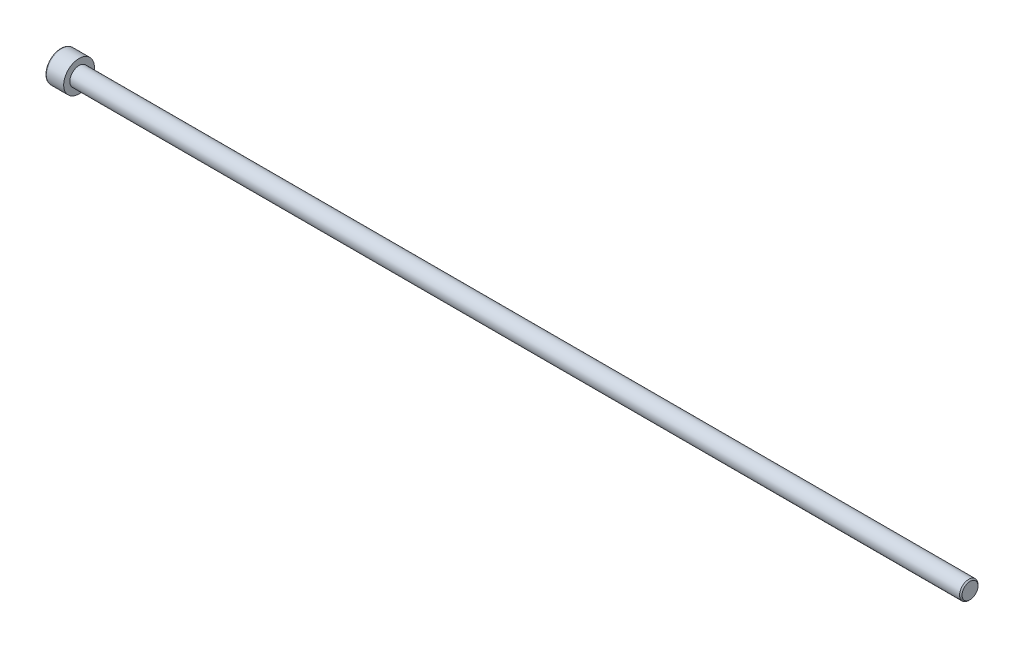
ISO-10303-21;
HEADER;
FILE_DESCRIPTION(('STEP AP214'),'2;1');
FILE_NAME('part.step','',(''),(''),'','','');
FILE_SCHEMA(('AUTOMOTIVE_DESIGN { 1 0 10303 214 1 1 1 1 }'));
ENDSEC;
DATA;
#1=APPLICATION_CONTEXT('core data for automotive mechanical design processes');
#2=APPLICATION_PROTOCOL_DEFINITION('international standard','automotive_design',2000,#1);
#3=PRODUCT_CONTEXT('',#1,'mechanical');
#4=PRODUCT('Part','Part','',(#3));
#5=PRODUCT_RELATED_PRODUCT_CATEGORY('part','',(#4));
#6=PRODUCT_DEFINITION_FORMATION('','',#4);
#7=PRODUCT_DEFINITION_CONTEXT('part definition',#1,'design');
#8=PRODUCT_DEFINITION('design','',#6,#7);
#9=PRODUCT_DEFINITION_SHAPE('','',#8);
#10=(LENGTH_UNIT() NAMED_UNIT(*) SI_UNIT(.MILLI.,.METRE.));
#11=(NAMED_UNIT(*) PLANE_ANGLE_UNIT() SI_UNIT($,.RADIAN.));
#12=(NAMED_UNIT(*) SI_UNIT($,.STERADIAN.) SOLID_ANGLE_UNIT());
#13=UNCERTAINTY_MEASURE_WITH_UNIT(LENGTH_MEASURE(1.E-05),#10,'distance_accuracy_value','');
#14=(GEOMETRIC_REPRESENTATION_CONTEXT(3) GLOBAL_UNCERTAINTY_ASSIGNED_CONTEXT((#13)) GLOBAL_UNIT_ASSIGNED_CONTEXT((#10,
#11,#12)) REPRESENTATION_CONTEXT('',''));
#15=CARTESIAN_POINT('',(0.,0.,0.));
#16=DIRECTION('',(0.,0.,1.));
#17=DIRECTION('',(1.,0.,0.));
#18=AXIS2_PLACEMENT_3D('',#15,#16,#17);
#19=CARTESIAN_POINT('',(0.,0.,0.));
#20=DIRECTION('',(1.,0.,0.));
#21=DIRECTION('',(0.,0.,-1.));
#22=AXIS2_PLACEMENT_3D('',#19,#20,#21);
#23=PLANE('',#22);
#24=CARTESIAN_POINT('',(0.,0.,0.));
#25=DIRECTION('',(1.,0.,0.));
#26=DIRECTION('',(0.,0.,-1.));
#27=AXIS2_PLACEMENT_3D('',#24,#25,#26);
#28=CIRCLE('',#27,5.);
#29=CARTESIAN_POINT('',(0.,0.,-5.));
#30=VERTEX_POINT('',#29);
#31=EDGE_CURVE('E224',#30,#30,#28,.T.);
#32=ORIENTED_EDGE('',*,*,#31,.T.);
#33=EDGE_LOOP('',(#32));
#34=FACE_BOUND('',#33,.T.);
#35=CARTESIAN_POINT('',(0.,0.,0.));
#36=DIRECTION('',(1.,0.,0.));
#37=DIRECTION('',(0.,0.,-1.));
#38=AXIS2_PLACEMENT_3D('',#35,#36,#37);
#39=CIRCLE('',#38,3.);
#40=CARTESIAN_POINT('',(0.,0.,-3.));
#41=VERTEX_POINT('',#40);
#42=EDGE_CURVE('E221',#41,#41,#39,.T.);
#43=ORIENTED_EDGE('',*,*,#42,.F.);
#44=EDGE_LOOP('',(#43));
#45=FACE_BOUND('',#44,.T.);
#46=ADVANCED_FACE('F16',(#34,#45),#23,.T.);
#47=CARTESIAN_POINT('',(-6.,0.,0.));
#48=DIRECTION('',(1.,0.,0.));
#49=DIRECTION('',(0.,0.,-1.));
#50=AXIS2_PLACEMENT_3D('',#47,#48,#49);
#51=CYLINDRICAL_SURFACE('',#50,5.);
#52=CARTESIAN_POINT('',(-5.6,0.,0.));
#53=DIRECTION('',(1.,0.,0.));
#54=DIRECTION('',(0.,0.,-1.));
#55=AXIS2_PLACEMENT_3D('',#52,#53,#54);
#56=CIRCLE('',#55,5.);
#57=CARTESIAN_POINT('',(-5.6,0.,-5.));
#58=VERTEX_POINT('',#57);
#59=EDGE_CURVE('E232',#58,#58,#56,.T.);
#60=ORIENTED_EDGE('',*,*,#59,.T.);
#61=EDGE_LOOP('',(#60));
#62=FACE_BOUND('',#61,.T.);
#63=ORIENTED_EDGE('',*,*,#31,.F.);
#64=EDGE_LOOP('',(#63));
#65=FACE_BOUND('',#64,.T.);
#66=ADVANCED_FACE('F18',(#62,#65),#51,.T.);
#67=CARTESIAN_POINT('',(-6.,0.,0.));
#68=DIRECTION('',(1.,0.,0.));
#69=DIRECTION('',(0.,0.,-1.));
#70=AXIS2_PLACEMENT_3D('',#67,#68,#69);
#71=PLANE('',#70);
#72=CARTESIAN_POINT('',(-6.,0.,0.));
#73=DIRECTION('',(1.,0.,0.));
#74=DIRECTION('',(0.,0.,-1.));
#75=AXIS2_PLACEMENT_3D('',#72,#73,#74);
#76=CIRCLE('',#75,4.6);
#77=CARTESIAN_POINT('',(-6.,0.,-4.6));
#78=VERTEX_POINT('',#77);
#79=EDGE_CURVE('E29',#78,#78,#76,.F.);
#80=ORIENTED_EDGE('',*,*,#79,.T.);
#81=EDGE_LOOP('',(#80));
#82=FACE_BOUND('',#81,.T.);
#83=CARTESIAN_POINT('',(-6.,0.,0.));
#84=DIRECTION('',(-1.,0.,0.));
#85=DIRECTION('',(0.,0.,1.));
#86=AXIS2_PLACEMENT_3D('',#83,#84,#85);
#87=CIRCLE('',#86,2.88675134594813);
#88=CARTESIAN_POINT('',(-6.,1.44337567297406,-2.5));
#89=VERTEX_POINT('',#88);
#90=CARTESIAN_POINT('',(-6.,-1.44337567297406,-2.5));
#91=VERTEX_POINT('',#90);
#92=EDGE_CURVE('E185',#89,#91,#87,.T.);
#93=ORIENTED_EDGE('',*,*,#92,.F.);
#94=CARTESIAN_POINT('',(-6.,2.88675134594813,0.));
#95=VERTEX_POINT('',#94);
#96=EDGE_CURVE('E90',#95,#89,#87,.T.);
#97=ORIENTED_EDGE('',*,*,#96,.F.);
#98=CARTESIAN_POINT('',(-6.,1.44337567297406,2.5));
#99=VERTEX_POINT('',#98);
#100=EDGE_CURVE('E35',#99,#95,#87,.T.);
#101=ORIENTED_EDGE('',*,*,#100,.F.);
#102=CARTESIAN_POINT('',(-6.,-1.44337567297406,2.5));
#103=VERTEX_POINT('',#102);
#104=EDGE_CURVE('E42',#103,#99,#87,.T.);
#105=ORIENTED_EDGE('',*,*,#104,.F.);
#106=CARTESIAN_POINT('',(-6.,-2.88675134594813,0.));
#107=VERTEX_POINT('',#106);
#108=EDGE_CURVE('E86',#107,#103,#87,.T.);
#109=ORIENTED_EDGE('',*,*,#108,.F.);
#110=EDGE_CURVE('E188',#91,#107,#87,.T.);
#111=ORIENTED_EDGE('',*,*,#110,.F.);
#112=EDGE_LOOP('',(#93,#97,#101,#105,#109,#111));
#113=FACE_BOUND('',#112,.T.);
#114=ADVANCED_FACE('F164',(#82,#113),#71,.F.);
#115=CARTESIAN_POINT('',(290.,0.,0.));
#116=DIRECTION('',(-1.,0.,0.));
#117=DIRECTION('',(0.,0.,1.));
#118=AXIS2_PLACEMENT_3D('',#115,#116,#117);
#119=CYLINDRICAL_SURFACE('',#118,3.);
#120=CARTESIAN_POINT('',(289.6,0.,0.));
#121=DIRECTION('',(1.,0.,0.));
#122=DIRECTION('',(0.,0.,-1.));
#123=AXIS2_PLACEMENT_3D('',#120,#121,#122);
#124=CIRCLE('',#123,3.);
#125=CARTESIAN_POINT('',(289.6,0.,-3.));
#126=VERTEX_POINT('',#125);
#127=EDGE_CURVE('E229',#126,#126,#124,.F.);
#128=ORIENTED_EDGE('',*,*,#127,.T.);
#129=EDGE_LOOP('',(#128));
#130=FACE_BOUND('',#129,.T.);
#131=ORIENTED_EDGE('',*,*,#42,.T.);
#132=EDGE_LOOP('',(#131));
#133=FACE_BOUND('',#132,.T.);
#134=ADVANCED_FACE('F169',(#130,#133),#119,.T.);
#135=CARTESIAN_POINT('',(290.,0.,0.));
#136=DIRECTION('',(1.,0.,0.));
#137=DIRECTION('',(0.,0.,-1.));
#138=AXIS2_PLACEMENT_3D('',#135,#136,#137);
#139=PLANE('',#138);
#140=CARTESIAN_POINT('',(290.,0.,0.));
#141=DIRECTION('',(1.,0.,0.));
#142=DIRECTION('',(0.,0.,-1.));
#143=AXIS2_PLACEMENT_3D('',#140,#141,#142);
#144=CIRCLE('',#143,2.6);
#145=CARTESIAN_POINT('',(290.,0.,-2.6));
#146=VERTEX_POINT('',#145);
#147=EDGE_CURVE('E226',#146,#146,#144,.T.);
#148=ORIENTED_EDGE('',*,*,#147,.T.);
#149=EDGE_LOOP('',(#148));
#150=FACE_BOUND('',#149,.T.);
#151=ADVANCED_FACE('F176',(#150),#139,.T.);
#152=CARTESIAN_POINT('',(290.,0.,0.));
#153=DIRECTION('',(-1.,0.,0.));
#154=DIRECTION('',(0.,0.,1.));
#155=AXIS2_PLACEMENT_3D('',#152,#153,#154);
#156=CONICAL_SURFACE('',#155,2.6,0.785398163397448);
#157=ORIENTED_EDGE('',*,*,#127,.F.);
#158=EDGE_LOOP('',(#157));
#159=FACE_BOUND('',#158,.T.);
#160=ORIENTED_EDGE('',*,*,#147,.F.);
#161=EDGE_LOOP('',(#160));
#162=FACE_BOUND('',#161,.T.);
#163=ADVANCED_FACE('F238',(#159,#162),#156,.T.);
#164=CARTESIAN_POINT('',(-5.6,0.,0.));
#165=DIRECTION('',(1.,0.,0.));
#166=DIRECTION('',(0.,0.,-1.));
#167=AXIS2_PLACEMENT_3D('',#164,#165,#166);
#168=TOROIDAL_SURFACE('',#167,4.6,0.4);
#169=ORIENTED_EDGE('',*,*,#79,.F.);
#170=EDGE_LOOP('',(#169));
#171=FACE_BOUND('',#170,.T.);
#172=ORIENTED_EDGE('',*,*,#59,.F.);
#173=EDGE_LOOP('',(#172));
#174=FACE_BOUND('',#173,.T.);
#175=ADVANCED_FACE('F114',(#171,#174),#168,.T.);
#176=CARTESIAN_POINT('',(-6.,0.,0.));
#177=DIRECTION('',(-1.,0.,0.));
#178=DIRECTION('',(0.,0.,1.));
#179=AXIS2_PLACEMENT_3D('',#176,#177,#178);
#180=CONICAL_SURFACE('',#179,2.88675134594813,0.785398163397449);
#181=ORIENTED_EDGE('',*,*,#92,.T.);
#182=CARTESIAN_POINT('',(-6.84474007079348,-2.77020363749965,-2.5));
#183=CARTESIAN_POINT('',(-6.79429722492207,-2.70224105261352,-2.5));
#184=CARTESIAN_POINT('',(-6.74437428132195,-2.63388631523702,-2.5));
#185=CARTESIAN_POINT('',(-6.6457965616641,-2.49624219493107,-2.5));
#186=CARTESIAN_POINT('',(-6.59714212349124,-2.42695257029051,-2.5));
#187=CARTESIAN_POINT('',(-6.50098521782354,-2.28678261475764,-2.5));
#188=CARTESIAN_POINT('',(-6.45349461032761,-2.21589411491334,-2.5));
#189=CARTESIAN_POINT('',(-6.36039504663181,-2.07289801787356,-2.5));
#190=CARTESIAN_POINT('',(-6.31478595409544,-2.00079050954437,-2.5));
#191=CARTESIAN_POINT('',(-6.22353453272335,-1.85136748078596,-2.5));
#192=CARTESIAN_POINT('',(-6.17801448280433,-1.77397645435118,-2.5));
#193=CARTESIAN_POINT('',(-6.09013743232321,-1.61742301914699,-2.5));
#194=CARTESIAN_POINT('',(-6.04778097195943,-1.53826031083992,-2.5));
#195=CARTESIAN_POINT('',(-5.92683684295154,-1.29823189208257,-2.5));
#196=CARTESIAN_POINT('',(-5.85401661333079,-1.1342610602898,-2.5));
#197=CARTESIAN_POINT('',(-5.76496495977957,-0.887111376658195,-2.5));
#198=CARTESIAN_POINT('',(-5.73923498673255,-0.807344623014013,-2.5));
#199=CARTESIAN_POINT('',(-5.69419468259281,-0.645977302232372,-2.5));
#200=CARTESIAN_POINT('',(-5.67488482571007,-0.564376600108745,-2.5));
#201=CARTESIAN_POINT('',(-5.64398238462547,-0.401145738642202,-2.5));
#202=CARTESIAN_POINT('',(-5.63226395285079,-0.319539755889809,-2.5));
#203=CARTESIAN_POINT('',(-5.61675591058852,-0.155573726076,-2.5));
#204=CARTESIAN_POINT('',(-5.61296514163113,-0.0732137909566039,-2.5));
#205=CARTESIAN_POINT('',(-5.61355627439258,0.0889406031113437,-2.5));
#206=CARTESIAN_POINT('',(-5.61769048544945,0.168736084862772,-2.5));
#207=CARTESIAN_POINT('',(-5.63338028621219,0.327588900916059,-2.5));
#208=CARTESIAN_POINT('',(-5.64493662827971,0.40664615956188,-2.5));
#209=CARTESIAN_POINT('',(-5.67505484099945,0.564788206138294,-2.5));
#210=CARTESIAN_POINT('',(-5.69373233849525,0.643850665727806,-2.5));
#211=CARTESIAN_POINT('',(-5.73713308321226,0.800257178762727,-2.5));
#212=CARTESIAN_POINT('',(-5.76185569915047,0.877601410720765,-2.5));
#213=CARTESIAN_POINT('',(-5.8505231521358,1.12635295448186,-2.5));
#214=CARTESIAN_POINT('',(-5.92477831457632,1.29410071737717,-2.5));
#215=CARTESIAN_POINT('',(-6.04840793358226,1.53952732936915,-2.5));
#216=CARTESIAN_POINT('',(-6.09175812369351,1.62045951003842,-2.5));
#217=CARTESIAN_POINT('',(-6.18175198341865,1.78047621260416,-2.5));
#218=CARTESIAN_POINT('',(-6.22839504475115,1.85956107217667,-2.5));
#219=CARTESIAN_POINT('',(-6.32189053147965,2.0121708481034,-2.5));
#220=CARTESIAN_POINT('',(-6.36861450061921,2.0857753797604,-2.5));
#221=CARTESIAN_POINT('',(-6.46400118848708,2.23172390389514,-2.5));
#222=CARTESIAN_POINT('',(-6.51266405539446,2.3040677994199,-2.5));
#223=CARTESIAN_POINT('',(-6.61117183334436,2.44706675931361,-2.5));
#224=CARTESIAN_POINT('',(-6.66100374373306,2.51773081675014,-2.5));
#225=CARTESIAN_POINT('',(-6.76196495827716,2.65809767168231,-2.5));
#226=CARTESIAN_POINT('',(-6.81309390325579,2.72780072722296,-2.5));
#227=CARTESIAN_POINT('',(-6.86475257525147,2.79710237044981,-2.5));
#228=B_SPLINE_CURVE_WITH_KNOTS('',3,(#182,#183,#184,#185,#186,#187,#188,#189,#190,#191,#192,
#193,#194,#195,#196,#197,#198,#199,#200,#201,#202,#203,#204,#205,#206,#207,#208,#209,#210,#211,
#212,#213,#214,#215,#216,#217,#218,#219,#220,#221,#222,#223,#224,#225,#226,#227),.UNSPECIFIED.,
.F.,.F.,(4,2,2,2,2,2,2,2,2,2,2,2,2,2,2,2,2,2,2,2,2,2,4),(0.,0.253915366034021,0.507897689072883,
0.763849696603631,1.01978312489611,1.28906200095732,1.55838675307382,2.09503555587664,
2.34626885024813,2.59752069738117,2.84449291832419,3.09142904668035,3.33077296373735,
3.57014114627995,3.81357397782878,4.0569813988868,4.60559640969275,4.88100918632303,
5.15637121930272,5.41788736840583,5.67942354219825,5.93881039285586,6.19812618136686),.UNSPECIFIED.);
#229=EDGE_CURVE('E11',#89,#91,#228,.F.);
#230=ORIENTED_EDGE('',*,*,#229,.F.);
#231=EDGE_LOOP('',(#181,#230));
#232=FACE_BOUND('',#231,.T.);
#233=ADVANCED_FACE('F112',(#232),#180,.F.);
#234=ORIENTED_EDGE('',*,*,#110,.T.);
#235=CARTESIAN_POINT('',(-6.00011547698176,-1.44326020292023,-2.5002));
#236=CARTESIAN_POINT('',(-5.95054070535472,-1.49287669073469,-2.41426172221224));
#237=CARTESIAN_POINT('',(-5.9038774813625,-1.5433228376411,-2.32688643272425));
#238=CARTESIAN_POINT('',(-5.8184381400383,-1.64618811625259,-2.14871854383441));
#239=CARTESIAN_POINT('',(-5.779709562406,-1.6986170312236,-2.05790899931892));
#240=CARTESIAN_POINT('',(-5.71336670389774,-1.80433744175986,-1.87479587687308));
#241=CARTESIAN_POINT('',(-5.68558566853085,-1.85760201171316,-1.78253893547066));
#242=CARTESIAN_POINT('',(-5.64278317591067,-1.96530378549009,-1.59599399122372));
#243=CARTESIAN_POINT('',(-5.62772976667135,-2.01973769896307,-1.50171168743372));
#244=CARTESIAN_POINT('',(-5.61414772220949,-2.11355131286833,-1.33922174170815));
#245=CARTESIAN_POINT('',(-5.6121370992408,-2.15280980880341,-1.27122403211985));
#246=CARTESIAN_POINT('',(-5.61552411718749,-2.23126263056549,-1.13533975883078));
#247=CARTESIAN_POINT('',(-5.62092435529982,-2.27045692907358,-1.06745324244776));
#248=CARTESIAN_POINT('',(-5.63882578840247,-2.34847544336505,-0.932321211763895));
#249=CARTESIAN_POINT('',(-5.65133492704648,-2.38729919566123,-0.86507650024644));
#250=CARTESIAN_POINT('',(-5.68276750195571,-2.46427534467604,-0.731749899181802));
#251=CARTESIAN_POINT('',(-5.70169044649682,-2.50242779262542,-0.665667920900344));
#252=CARTESIAN_POINT('',(-5.75786736140825,-2.60015256308362,-0.496403653308737));
#253=CARTESIAN_POINT('',(-5.79935583159619,-2.65911894852989,-0.394270877777108));
#254=CARTESIAN_POINT('',(-5.86939404672309,-2.74582384890657,-0.244093585059492));
#255=CARTESIAN_POINT('',(-5.89400225211607,-2.77439698586412,-0.194603460117392));
#256=CARTESIAN_POINT('',(-5.94546188671523,-2.83101398781794,-0.0965399361611551));
#257=CARTESIAN_POINT('',(-5.97231193877936,-2.85905816495513,-0.0479659965030734));
#258=CARTESIAN_POINT('',(-6.00011547698176,-2.88686681600197,0.000200000000000257));
#259=B_SPLINE_CURVE_WITH_KNOTS('',3,(#235,#236,#237,#238,#239,#240,#241,#242,#243,#244,#245,
#246,#247,#248,#249,#250,#251,#252,#253,#254,#255,#256,#257,#258),.UNSPECIFIED.,.F.,.F.,(4,2,2,
2,2,2,2,2,2,2,2,4),(0.,0.333012085133925,0.667964518301396,0.997597032043297,1.32639954393844,
1.56169424147168,1.79707142102083,2.0327121352217,2.2683347877565,2.64260240809533,
2.82922877818863,3.01574133749024),.UNSPECIFIED.);
#260=EDGE_CURVE('E89',#91,#107,#259,.T.);
#261=ORIENTED_EDGE('',*,*,#260,.F.);
#262=EDGE_LOOP('',(#234,#261));
#263=FACE_BOUND('',#262,.T.);
#264=ADVANCED_FACE('F244',(#263),#180,.F.);
#265=ORIENTED_EDGE('',*,*,#108,.T.);
#266=CARTESIAN_POINT('',(-6.00011547698176,-2.88686681600197,-0.000199999999999966));
#267=CARTESIAN_POINT('',(-5.95054070535472,-2.83725032818751,0.0857382777877657));
#268=CARTESIAN_POINT('',(-5.9038774813625,-2.78680418128109,0.173113567275755));
#269=CARTESIAN_POINT('',(-5.8184381400383,-2.6839389026696,0.35128145616559));
#270=CARTESIAN_POINT('',(-5.779709562406,-2.6315099876986,0.442091000681075));
#271=CARTESIAN_POINT('',(-5.71336670389774,-2.52578957716234,0.62520412312692));
#272=CARTESIAN_POINT('',(-5.68558566853085,-2.47252500720904,0.717461064529339));
#273=CARTESIAN_POINT('',(-5.64278317591067,-2.3648232334321,0.904006008776285));
#274=CARTESIAN_POINT('',(-5.62772976667135,-2.31038931995913,0.998288312566283));
#275=CARTESIAN_POINT('',(-5.61414772220949,-2.21657570605387,1.16077825829184));
#276=CARTESIAN_POINT('',(-5.6121370992408,-2.17731721011878,1.22877596788015));
#277=CARTESIAN_POINT('',(-5.61552411718749,-2.0988643883567,1.36466024116922));
#278=CARTESIAN_POINT('',(-5.62092435529982,-2.05967008984862,1.43254675755224));
#279=CARTESIAN_POINT('',(-5.63882578840247,-1.98165157555715,1.5676787882361));
#280=CARTESIAN_POINT('',(-5.65133492704648,-1.94282782326097,1.63492349975356));
#281=CARTESIAN_POINT('',(-5.68276750195571,-1.86585167424616,1.7682501008182));
#282=CARTESIAN_POINT('',(-5.70169044649682,-1.82769922629678,1.83433207909965));
#283=CARTESIAN_POINT('',(-5.75786736140825,-1.72997445583858,2.00359634669126));
#284=CARTESIAN_POINT('',(-5.79935583159619,-1.67100807039231,2.10572912222289));
#285=CARTESIAN_POINT('',(-5.86939404672309,-1.58430317001562,2.25590641494051));
#286=CARTESIAN_POINT('',(-5.89400225211607,-1.55573003305807,2.30539653988261));
#287=CARTESIAN_POINT('',(-5.94546188671523,-1.49911303110426,2.40346006383885));
#288=CARTESIAN_POINT('',(-5.97231193877935,-1.47106885396706,2.45203400349693));
#289=CARTESIAN_POINT('',(-6.00011547698176,-1.44326020292023,2.5002));
#290=B_SPLINE_CURVE_WITH_KNOTS('',3,(#266,#267,#268,#269,#270,#271,#272,#273,#274,#275,#276,
#277,#278,#279,#280,#281,#282,#283,#284,#285,#286,#287,#288,#289),.UNSPECIFIED.,.F.,.F.,(4,2,2,
2,2,2,2,2,2,2,2,4),(0.,0.333012085133925,0.667964518301396,0.997597032043296,1.32639954393844,
1.56169424147168,1.79707142102082,2.0327121352217,2.2683347877565,2.64260240809533,
2.82922877818863,3.01574133749024),.UNSPECIFIED.);
#291=EDGE_CURVE('E97',#107,#103,#290,.T.);
#292=ORIENTED_EDGE('',*,*,#291,.F.);
#293=EDGE_LOOP('',(#265,#292));
#294=FACE_BOUND('',#293,.T.);
#295=ADVANCED_FACE('F194',(#294),#180,.F.);
#296=ORIENTED_EDGE('',*,*,#104,.T.);
#297=CARTESIAN_POINT('',(-6.84474007079348,-2.77020363749965,2.5));
#298=CARTESIAN_POINT('',(-6.79429722492207,-2.70224105261352,2.5));
#299=CARTESIAN_POINT('',(-6.74437428132195,-2.63388631523702,2.5));
#300=CARTESIAN_POINT('',(-6.6457965616641,-2.49624219493107,2.5));
#301=CARTESIAN_POINT('',(-6.59714212349124,-2.4269525702905,2.5));
#302=CARTESIAN_POINT('',(-6.50098521782354,-2.28678261475764,2.5));
#303=CARTESIAN_POINT('',(-6.45349461032761,-2.21589411491334,2.5));
#304=CARTESIAN_POINT('',(-6.36039504663181,-2.07289801787356,2.5));
#305=CARTESIAN_POINT('',(-6.31478595409544,-2.00079050954437,2.5));
#306=CARTESIAN_POINT('',(-6.22353453272334,-1.85136748078596,2.5));
#307=CARTESIAN_POINT('',(-6.17801448280433,-1.77397645435118,2.5));
#308=CARTESIAN_POINT('',(-6.09013743232321,-1.61742301914699,2.5));
#309=CARTESIAN_POINT('',(-6.04778097195943,-1.53826031083992,2.5));
#310=CARTESIAN_POINT('',(-5.92683684295154,-1.29823189208257,2.5));
#311=CARTESIAN_POINT('',(-5.85401661333079,-1.1342610602898,2.5));
#312=CARTESIAN_POINT('',(-5.76496495977957,-0.887111376658195,2.5));
#313=CARTESIAN_POINT('',(-5.73923498673255,-0.807344623014013,2.5));
#314=CARTESIAN_POINT('',(-5.69419468259281,-0.645977302232372,2.5));
#315=CARTESIAN_POINT('',(-5.67488482571007,-0.564376600108746,2.5));
#316=CARTESIAN_POINT('',(-5.64398238462547,-0.401145738642202,2.5));
#317=CARTESIAN_POINT('',(-5.63226395285079,-0.319539755889809,2.5));
#318=CARTESIAN_POINT('',(-5.61675591058852,-0.155573726076001,2.5));
#319=CARTESIAN_POINT('',(-5.61296514163113,-0.0732137909566044,2.5));
#320=CARTESIAN_POINT('',(-5.61355627439258,0.0889406031113432,2.5));
#321=CARTESIAN_POINT('',(-5.61769048544945,0.168736084862772,2.5));
#322=CARTESIAN_POINT('',(-5.63338028621219,0.327588900916058,2.5));
#323=CARTESIAN_POINT('',(-5.64493662827971,0.406646159561879,2.5));
#324=CARTESIAN_POINT('',(-5.67505484099945,0.564788206138294,2.5));
#325=CARTESIAN_POINT('',(-5.69373233849525,0.643850665727805,2.5));
#326=CARTESIAN_POINT('',(-5.73713308321226,0.800257178762726,2.5));
#327=CARTESIAN_POINT('',(-5.76185569915047,0.877601410720764,2.5));
#328=CARTESIAN_POINT('',(-5.8505231521358,1.12635295448185,2.5));
#329=CARTESIAN_POINT('',(-5.92477831457632,1.29410071737717,2.5));
#330=CARTESIAN_POINT('',(-6.04840793358226,1.53952732936915,2.5));
#331=CARTESIAN_POINT('',(-6.09175812369351,1.62045951003841,2.5));
#332=CARTESIAN_POINT('',(-6.18175198341865,1.78047621260416,2.5));
#333=CARTESIAN_POINT('',(-6.22839504475115,1.85956107217666,2.5));
#334=CARTESIAN_POINT('',(-6.32189053147965,2.01217084810339,2.5));
#335=CARTESIAN_POINT('',(-6.3686145006192,2.0857753797604,2.5));
#336=CARTESIAN_POINT('',(-6.46400118848708,2.23172390389513,2.5));
#337=CARTESIAN_POINT('',(-6.51266405539445,2.3040677994199,2.5));
#338=CARTESIAN_POINT('',(-6.61117183334436,2.44706675931361,2.5));
#339=CARTESIAN_POINT('',(-6.66100374373306,2.51773081675013,2.5));
#340=CARTESIAN_POINT('',(-6.76196495827715,2.6580976716823,2.5));
#341=CARTESIAN_POINT('',(-6.81309390325578,2.72780072722295,2.5));
#342=CARTESIAN_POINT('',(-6.86475257525146,2.79710237044981,2.5));
#343=B_SPLINE_CURVE_WITH_KNOTS('',3,(#297,#298,#299,#300,#301,#302,#303,#304,#305,#306,#307,
#308,#309,#310,#311,#312,#313,#314,#315,#316,#317,#318,#319,#320,#321,#322,#323,#324,#325,#326,
#327,#328,#329,#330,#331,#332,#333,#334,#335,#336,#337,#338,#339,#340,#341,#342),.UNSPECIFIED.,
.F.,.F.,(4,2,2,2,2,2,2,2,2,2,2,2,2,2,2,2,2,2,2,2,2,2,4),(0.,0.253915366034021,0.507897689072884,
0.763849696603632,1.01978312489611,1.28906200095732,1.55838675307382,2.09503555587664,
2.34626885024813,2.59752069738117,2.84449291832419,3.09142904668035,3.33077296373735,
3.57014114627995,3.81357397782878,4.0569813988868,4.60559640969274,4.88100918632302,
5.15637121930272,5.41788736840583,5.67942354219824,5.93881039285585,6.19812618136685),.UNSPECIFIED.);
#344=EDGE_CURVE('E122',#103,#99,#343,.T.);
#345=ORIENTED_EDGE('',*,*,#344,.F.);
#346=EDGE_LOOP('',(#296,#345));
#347=FACE_BOUND('',#346,.T.);
#348=ADVANCED_FACE('F197',(#347),#180,.F.);
#349=ORIENTED_EDGE('',*,*,#100,.T.);
#350=CARTESIAN_POINT('',(-6.00011547698176,1.44326020292023,2.5002));
#351=CARTESIAN_POINT('',(-5.95054070535472,1.49287669073469,2.41426172221224));
#352=CARTESIAN_POINT('',(-5.9038774813625,1.5433228376411,2.32688643272425));
#353=CARTESIAN_POINT('',(-5.8184381400383,1.64618811625259,2.14871854383441));
#354=CARTESIAN_POINT('',(-5.779709562406,1.6986170312236,2.05790899931892));
#355=CARTESIAN_POINT('',(-5.71336670389774,1.80433744175986,1.87479587687308));
#356=CARTESIAN_POINT('',(-5.68558566853085,1.85760201171316,1.78253893547066));
#357=CARTESIAN_POINT('',(-5.64278317591067,1.96530378549009,1.59599399122372));
#358=CARTESIAN_POINT('',(-5.62772976667135,2.01973769896307,1.50171168743372));
#359=CARTESIAN_POINT('',(-5.61414772220949,2.11355131286833,1.33922174170815));
#360=CARTESIAN_POINT('',(-5.6121370992408,2.15280980880341,1.27122403211985));
#361=CARTESIAN_POINT('',(-5.61552411718749,2.23126263056549,1.13533975883078));
#362=CARTESIAN_POINT('',(-5.62092435529982,2.27045692907358,1.06745324244776));
#363=CARTESIAN_POINT('',(-5.63882578840247,2.34847544336505,0.932321211763895));
#364=CARTESIAN_POINT('',(-5.65133492704648,2.38729919566123,0.86507650024644));
#365=CARTESIAN_POINT('',(-5.68276750195571,2.46427534467604,0.731749899181802));
#366=CARTESIAN_POINT('',(-5.70169044649682,2.50242779262542,0.665667920900344));
#367=CARTESIAN_POINT('',(-5.75786736140825,2.60015256308362,0.496403653308737));
#368=CARTESIAN_POINT('',(-5.79935583159619,2.65911894852989,0.394270877777108));
#369=CARTESIAN_POINT('',(-5.86939404672309,2.74582384890657,0.244093585059492));
#370=CARTESIAN_POINT('',(-5.89400225211607,2.77439698586412,0.194603460117392));
#371=CARTESIAN_POINT('',(-5.94546188671523,2.83101398781794,0.0965399361611551));
#372=CARTESIAN_POINT('',(-5.97231193877936,2.85905816495513,0.0479659965030735));
#373=CARTESIAN_POINT('',(-6.00011547698176,2.88686681600197,-0.000200000000000244));
#374=B_SPLINE_CURVE_WITH_KNOTS('',3,(#350,#351,#352,#353,#354,#355,#356,#357,#358,#359,#360,
#361,#362,#363,#364,#365,#366,#367,#368,#369,#370,#371,#372,#373),.UNSPECIFIED.,.F.,.F.,(4,2,2,
2,2,2,2,2,2,2,2,4),(0.,0.333012085133925,0.667964518301396,0.997597032043297,1.32639954393844,
1.56169424147168,1.79707142102083,2.0327121352217,2.2683347877565,2.64260240809533,
2.82922877818863,3.01574133749024),.UNSPECIFIED.);
#375=EDGE_CURVE('E128',#99,#95,#374,.T.);
#376=ORIENTED_EDGE('',*,*,#375,.F.);
#377=EDGE_LOOP('',(#349,#376));
#378=FACE_BOUND('',#377,.T.);
#379=ADVANCED_FACE('F110',(#378),#180,.F.);
#380=ORIENTED_EDGE('',*,*,#96,.T.);
#381=CARTESIAN_POINT('',(-6.00011547698176,2.88686681600197,0.00020000000000001));
#382=CARTESIAN_POINT('',(-5.95054070535472,2.83725032818751,-0.0857382777877656));
#383=CARTESIAN_POINT('',(-5.9038774813625,2.78680418128109,-0.173113567275755));
#384=CARTESIAN_POINT('',(-5.8184381400383,2.6839389026696,-0.35128145616559));
#385=CARTESIAN_POINT('',(-5.779709562406,2.6315099876986,-0.442091000681075));
#386=CARTESIAN_POINT('',(-5.71336670389774,2.52578957716234,-0.62520412312692));
#387=CARTESIAN_POINT('',(-5.68558566853085,2.47252500720904,-0.717461064529339));
#388=CARTESIAN_POINT('',(-5.64278317591067,2.3648232334321,-0.904006008776285));
#389=CARTESIAN_POINT('',(-5.62772976667135,2.31038931995913,-0.998288312566283));
#390=CARTESIAN_POINT('',(-5.61414772220949,2.21657570605387,-1.16077825829184));
#391=CARTESIAN_POINT('',(-5.6121370992408,2.17731721011878,-1.22877596788015));
#392=CARTESIAN_POINT('',(-5.61552411718749,2.0988643883567,-1.36466024116922));
#393=CARTESIAN_POINT('',(-5.62092435529982,2.05967008984862,-1.43254675755224));
#394=CARTESIAN_POINT('',(-5.63882578840247,1.98165157555715,-1.5676787882361));
#395=CARTESIAN_POINT('',(-5.65133492704648,1.94282782326097,-1.63492349975356));
#396=CARTESIAN_POINT('',(-5.68276750195571,1.86585167424616,-1.7682501008182));
#397=CARTESIAN_POINT('',(-5.70169044649682,1.82769922629678,-1.83433207909965));
#398=CARTESIAN_POINT('',(-5.75786736140825,1.72997445583858,-2.00359634669126));
#399=CARTESIAN_POINT('',(-5.79935583159619,1.67100807039231,-2.10572912222289));
#400=CARTESIAN_POINT('',(-5.86939404672309,1.58430317001562,-2.25590641494051));
#401=CARTESIAN_POINT('',(-5.89400225211607,1.55573003305807,-2.30539653988261));
#402=CARTESIAN_POINT('',(-5.94546188671523,1.49911303110426,-2.40346006383885));
#403=CARTESIAN_POINT('',(-5.97231193877935,1.47106885396706,-2.45203400349693));
#404=CARTESIAN_POINT('',(-6.00011547698176,1.44326020292023,-2.5002));
#405=B_SPLINE_CURVE_WITH_KNOTS('',3,(#381,#382,#383,#384,#385,#386,#387,#388,#389,#390,#391,
#392,#393,#394,#395,#396,#397,#398,#399,#400,#401,#402,#403,#404),.UNSPECIFIED.,.F.,.F.,(4,2,2,
2,2,2,2,2,2,2,2,4),(0.,0.333012085133925,0.667964518301396,0.997597032043296,1.32639954393844,
1.56169424147168,1.79707142102082,2.0327121352217,2.2683347877565,2.64260240809533,
2.82922877818863,3.01574133749024),.UNSPECIFIED.);
#406=EDGE_CURVE('E133',#95,#89,#405,.T.);
#407=ORIENTED_EDGE('',*,*,#406,.F.);
#408=EDGE_LOOP('',(#380,#407));
#409=FACE_BOUND('',#408,.T.);
#410=ADVANCED_FACE('F105',(#409),#180,.F.);
#411=CARTESIAN_POINT('',(-2.,-1.44337567297406,-2.5));
#412=DIRECTION('',(0.,0.,-1.));
#413=DIRECTION('',(-1.,0.,0.));
#414=AXIS2_PLACEMENT_3D('',#411,#412,#413);
#415=PLANE('',#414);
#416=DIRECTION('',(-1.,0.,0.));
#417=VECTOR('',#416,1.);
#418=CARTESIAN_POINT('',(-2.,1.44337567297406,-2.5));
#419=LINE('',#418,#417);
#420=CARTESIAN_POINT('',(-2.,1.44337567297406,-2.5));
#421=VERTEX_POINT('',#420);
#422=EDGE_CURVE('E218',#421,#89,#419,.T.);
#423=ORIENTED_EDGE('',*,*,#422,.T.);
#424=ORIENTED_EDGE('',*,*,#229,.T.);
#425=DIRECTION('',(-1.,0.,0.));
#426=VECTOR('',#425,1.);
#427=CARTESIAN_POINT('',(-2.,-1.44337567297406,-2.5));
#428=LINE('',#427,#426);
#429=CARTESIAN_POINT('',(-2.,-1.44337567297406,-2.5));
#430=VERTEX_POINT('',#429);
#431=EDGE_CURVE('E212',#430,#91,#428,.T.);
#432=ORIENTED_EDGE('',*,*,#431,.F.);
#433=DIRECTION('',(0.,-1.,0.));
#434=VECTOR('',#433,1.);
#435=CARTESIAN_POINT('',(-2.,-1.44337567297406,-2.5));
#436=LINE('',#435,#434);
#437=EDGE_CURVE('E265',#421,#430,#436,.T.);
#438=ORIENTED_EDGE('',*,*,#437,.F.);
#439=EDGE_LOOP('',(#423,#424,#432,#438));
#440=FACE_BOUND('',#439,.T.);
#441=ADVANCED_FACE('F109',(#440),#415,.F.);
#442=CARTESIAN_POINT('',(-2.,-2.88675134594813,0.));
#443=DIRECTION('',(0.,-0.866025403784439,-0.5));
#444=DIRECTION('',(0.,0.5,-0.866025403784439));
#445=AXIS2_PLACEMENT_3D('',#442,#443,#444);
#446=PLANE('',#445);
#447=ORIENTED_EDGE('',*,*,#431,.T.);
#448=ORIENTED_EDGE('',*,*,#260,.T.);
#449=DIRECTION('',(-1.,0.,0.));
#450=VECTOR('',#449,1.);
#451=CARTESIAN_POINT('',(-2.,-2.88675134594813,0.));
#452=LINE('',#451,#450);
#453=CARTESIAN_POINT('',(-2.,-2.88675134594813,0.));
#454=VERTEX_POINT('',#453);
#455=EDGE_CURVE('E206',#454,#107,#452,.T.);
#456=ORIENTED_EDGE('',*,*,#455,.F.);
#457=DIRECTION('',(0.,-0.5,0.866025403784439));
#458=VECTOR('',#457,1.);
#459=CARTESIAN_POINT('',(-2.,-2.88675134594813,0.));
#460=LINE('',#459,#458);
#461=EDGE_CURVE('E271',#430,#454,#460,.T.);
#462=ORIENTED_EDGE('',*,*,#461,.F.);
#463=EDGE_LOOP('',(#447,#448,#456,#462));
#464=FACE_BOUND('',#463,.T.);
#465=ADVANCED_FACE('F103',(#464),#446,.F.);
#466=CARTESIAN_POINT('',(-2.,-1.44337567297406,2.5));
#467=DIRECTION('',(0.,-0.866025403784439,0.5));
#468=DIRECTION('',(0.,-0.5,-0.866025403784439));
#469=AXIS2_PLACEMENT_3D('',#466,#467,#468);
#470=PLANE('',#469);
#471=ORIENTED_EDGE('',*,*,#455,.T.);
#472=ORIENTED_EDGE('',*,*,#291,.T.);
#473=DIRECTION('',(-1.,0.,0.));
#474=VECTOR('',#473,1.);
#475=CARTESIAN_POINT('',(-2.,-1.44337567297406,2.5));
#476=LINE('',#475,#474);
#477=CARTESIAN_POINT('',(-2.,-1.44337567297406,2.5));
#478=VERTEX_POINT('',#477);
#479=EDGE_CURVE('E203',#478,#103,#476,.T.);
#480=ORIENTED_EDGE('',*,*,#479,.F.);
#481=DIRECTION('',(0.,0.5,0.866025403784439));
#482=VECTOR('',#481,1.);
#483=CARTESIAN_POINT('',(-2.,-1.44337567297406,2.5));
#484=LINE('',#483,#482);
#485=EDGE_CURVE('E275',#454,#478,#484,.T.);
#486=ORIENTED_EDGE('',*,*,#485,.F.);
#487=EDGE_LOOP('',(#471,#472,#480,#486));
#488=FACE_BOUND('',#487,.T.);
#489=ADVANCED_FACE('F147',(#488),#470,.F.);
#490=CARTESIAN_POINT('',(-2.,1.44337567297406,2.5));
#491=DIRECTION('',(0.,0.,1.));
#492=DIRECTION('',(1.,0.,0.));
#493=AXIS2_PLACEMENT_3D('',#490,#491,#492);
#494=PLANE('',#493);
#495=ORIENTED_EDGE('',*,*,#479,.T.);
#496=ORIENTED_EDGE('',*,*,#344,.T.);
#497=DIRECTION('',(-1.,0.,0.));
#498=VECTOR('',#497,1.);
#499=CARTESIAN_POINT('',(-2.,1.44337567297406,2.5));
#500=LINE('',#499,#498);
#501=CARTESIAN_POINT('',(-2.,1.44337567297406,2.5));
#502=VERTEX_POINT('',#501);
#503=EDGE_CURVE('E208',#502,#99,#500,.T.);
#504=ORIENTED_EDGE('',*,*,#503,.F.);
#505=DIRECTION('',(0.,1.,0.));
#506=VECTOR('',#505,1.);
#507=CARTESIAN_POINT('',(-2.,1.44337567297406,2.5));
#508=LINE('',#507,#506);
#509=EDGE_CURVE('E207',#478,#502,#508,.T.);
#510=ORIENTED_EDGE('',*,*,#509,.F.);
#511=EDGE_LOOP('',(#495,#496,#504,#510));
#512=FACE_BOUND('',#511,.T.);
#513=ADVANCED_FACE('F143',(#512),#494,.F.);
#514=CARTESIAN_POINT('',(-2.,2.88675134594813,0.));
#515=DIRECTION('',(0.,0.866025403784439,0.5));
#516=DIRECTION('',(0.,-0.5,0.866025403784439));
#517=AXIS2_PLACEMENT_3D('',#514,#515,#516);
#518=PLANE('',#517);
#519=ORIENTED_EDGE('',*,*,#503,.T.);
#520=ORIENTED_EDGE('',*,*,#375,.T.);
#521=DIRECTION('',(-1.,0.,0.));
#522=VECTOR('',#521,1.);
#523=CARTESIAN_POINT('',(-2.,2.88675134594813,0.));
#524=LINE('',#523,#522);
#525=CARTESIAN_POINT('',(-2.,2.88675134594813,0.));
#526=VERTEX_POINT('',#525);
#527=EDGE_CURVE('E210',#526,#95,#524,.T.);
#528=ORIENTED_EDGE('',*,*,#527,.F.);
#529=DIRECTION('',(0.,0.5,-0.866025403784439));
#530=VECTOR('',#529,1.);
#531=CARTESIAN_POINT('',(-2.,2.88675134594813,0.));
#532=LINE('',#531,#530);
#533=EDGE_CURVE('E220',#502,#526,#532,.T.);
#534=ORIENTED_EDGE('',*,*,#533,.F.);
#535=EDGE_LOOP('',(#519,#520,#528,#534));
#536=FACE_BOUND('',#535,.T.);
#537=ADVANCED_FACE('F139',(#536),#518,.F.);
#538=CARTESIAN_POINT('',(-2.,1.44337567297406,-2.5));
#539=DIRECTION('',(0.,0.866025403784439,-0.5));
#540=DIRECTION('',(0.,0.5,0.866025403784439));
#541=AXIS2_PLACEMENT_3D('',#538,#539,#540);
#542=PLANE('',#541);
#543=ORIENTED_EDGE('',*,*,#527,.T.);
#544=ORIENTED_EDGE('',*,*,#406,.T.);
#545=ORIENTED_EDGE('',*,*,#422,.F.);
#546=DIRECTION('',(0.,-0.5,-0.866025403784439));
#547=VECTOR('',#546,1.);
#548=CARTESIAN_POINT('',(-2.,1.44337567297406,-2.5));
#549=LINE('',#548,#547);
#550=EDGE_CURVE('E269',#526,#421,#549,.T.);
#551=ORIENTED_EDGE('',*,*,#550,.F.);
#552=EDGE_LOOP('',(#543,#544,#545,#551));
#553=FACE_BOUND('',#552,.T.);
#554=ADVANCED_FACE('F142',(#553),#542,.F.);
#555=CARTESIAN_POINT('',(-2.,0.,0.));
#556=DIRECTION('',(-1.,0.,0.));
#557=DIRECTION('',(0.,0.,1.));
#558=AXIS2_PLACEMENT_3D('',#555,#556,#557);
#559=PLANE('',#558);
#560=CARTESIAN_POINT('',(-2.,0.,0.));
#561=DIRECTION('',(-1.,0.,0.));
#562=DIRECTION('',(0.,0.,1.));
#563=AXIS2_PLACEMENT_3D('',#560,#561,#562);
#564=CIRCLE('',#563,3.);
#565=CARTESIAN_POINT('',(-2.,0.,3.));
#566=VERTEX_POINT('',#565);
#567=EDGE_CURVE('E83',#566,#566,#564,.T.);
#568=ORIENTED_EDGE('',*,*,#567,.F.);
#569=EDGE_LOOP('',(#568));
#570=FACE_BOUND('',#569,.T.);
#571=ORIENTED_EDGE('',*,*,#461,.T.);
#572=ORIENTED_EDGE('',*,*,#485,.T.);
#573=ORIENTED_EDGE('',*,*,#509,.T.);
#574=ORIENTED_EDGE('',*,*,#533,.T.);
#575=ORIENTED_EDGE('',*,*,#550,.T.);
#576=ORIENTED_EDGE('',*,*,#437,.T.);
#577=EDGE_LOOP('',(#571,#572,#573,#574,#575,#576));
#578=FACE_BOUND('',#577,.T.);
#579=ADVANCED_FACE('F79',(#570,#578),#559,.F.);
#580=CARTESIAN_POINT('',(-2.,0.,0.));
#581=DIRECTION('',(-1.,0.,0.));
#582=DIRECTION('',(0.,0.,1.));
#583=AXIS2_PLACEMENT_3D('',#580,#581,#582);
#584=CONICAL_SURFACE('',#583,3.,1.0471975511966);
#585=CARTESIAN_POINT('',(-0.267949192431132,0.,0.));
#586=VERTEX_POINT('',#585);
#587=VERTEX_LOOP('',#586);
#588=FACE_BOUND('',#587,.T.);
#589=ORIENTED_EDGE('',*,*,#567,.T.);
#590=EDGE_LOOP('',(#589));
#591=FACE_BOUND('',#590,.T.);
#592=ADVANCED_FACE('F76',(#588,#591),#584,.F.);
#593=CLOSED_SHELL('',(#46,#66,#114,#134,#151,#163,#175,#233,#264,#295,#348,#379,#410,#441,#465,
#489,#513,#537,#554,#579,#592));
#594=MANIFOLD_SOLID_BREP('B1',#593);
#595=ADVANCED_BREP_SHAPE_REPRESENTATION('',(#18,#594),#14);
#596=SHAPE_DEFINITION_REPRESENTATION(#9,#595);
ENDSEC;
END-ISO-10303-21;
